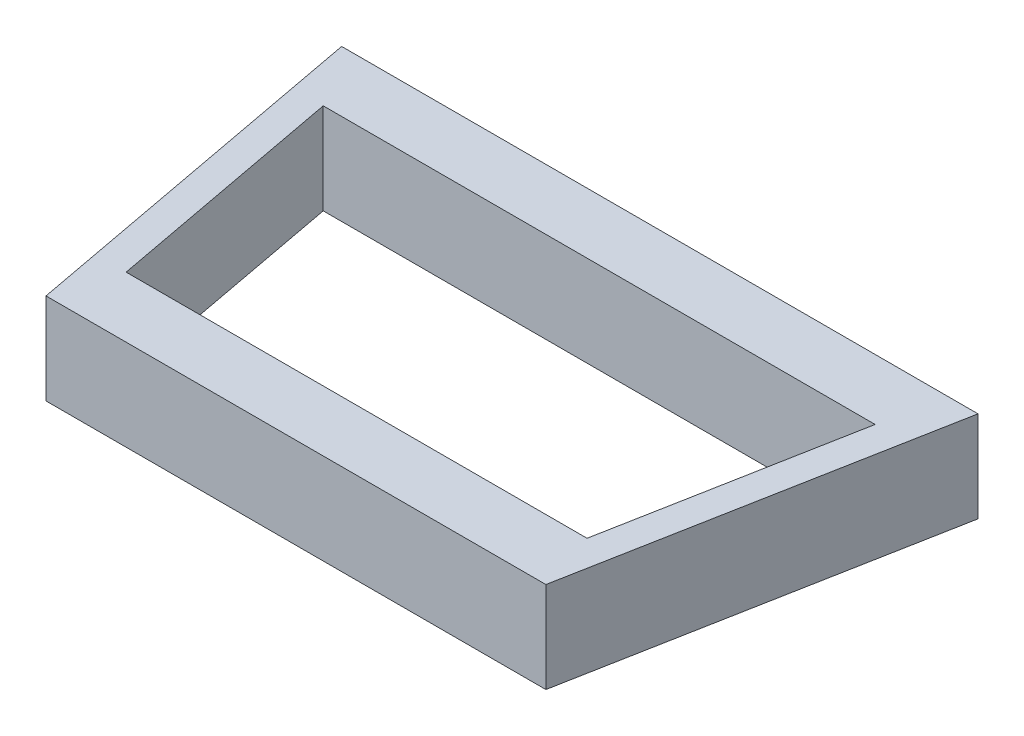
ISO-10303-21;
HEADER;
FILE_DESCRIPTION(('STEP AP214'),'2;1');
FILE_NAME('part.step','',(''),(''),'','','');
FILE_SCHEMA(('AUTOMOTIVE_DESIGN { 1 0 10303 214 1 1 1 1 }'));
ENDSEC;
DATA;
#1=APPLICATION_CONTEXT('core data for automotive mechanical design processes');
#2=APPLICATION_PROTOCOL_DEFINITION('international standard','automotive_design',2000,#1);
#3=PRODUCT_CONTEXT('',#1,'mechanical');
#4=PRODUCT('Part','Part','',(#3));
#5=PRODUCT_RELATED_PRODUCT_CATEGORY('part','',(#4));
#6=PRODUCT_DEFINITION_FORMATION('','',#4);
#7=PRODUCT_DEFINITION_CONTEXT('part definition',#1,'design');
#8=PRODUCT_DEFINITION('design','',#6,#7);
#9=PRODUCT_DEFINITION_SHAPE('','',#8);
#10=(LENGTH_UNIT() NAMED_UNIT(*) SI_UNIT(.MILLI.,.METRE.));
#11=(NAMED_UNIT(*) PLANE_ANGLE_UNIT() SI_UNIT($,.RADIAN.));
#12=(NAMED_UNIT(*) SI_UNIT($,.STERADIAN.) SOLID_ANGLE_UNIT());
#13=UNCERTAINTY_MEASURE_WITH_UNIT(LENGTH_MEASURE(1.E-05),#10,'distance_accuracy_value','');
#14=(GEOMETRIC_REPRESENTATION_CONTEXT(3) GLOBAL_UNCERTAINTY_ASSIGNED_CONTEXT((#13)) GLOBAL_UNIT_ASSIGNED_CONTEXT((#10,
#11,#12)) REPRESENTATION_CONTEXT('',''));
#15=CARTESIAN_POINT('',(0.,0.,0.));
#16=DIRECTION('',(0.,0.,1.));
#17=DIRECTION('',(1.,0.,0.));
#18=AXIS2_PLACEMENT_3D('',#15,#16,#17);
#19=CARTESIAN_POINT('',(0.,3.,0.));
#20=DIRECTION('',(0.,-1.,0.));
#21=DIRECTION('',(0.,0.,-1.));
#22=AXIS2_PLACEMENT_3D('',#19,#20,#21);
#23=PLANE('',#22);
#24=DIRECTION('',(-0.184288535050185,0.,-0.982872186934322));
#25=VECTOR('',#24,1.);
#26=CARTESIAN_POINT('',(-7.6,3.,4.));
#27=LINE('',#26,#25);
#28=CARTESIAN_POINT('',(-7.6,3.,4.));
#29=VERTEX_POINT('',#28);
#30=CARTESIAN_POINT('',(-9.1,3.,-4.));
#31=VERTEX_POINT('',#30);
#32=EDGE_CURVE('E108',#29,#31,#27,.T.);
#33=ORIENTED_EDGE('',*,*,#32,.T.);
#34=DIRECTION('',(1.,0.,0.));
#35=VECTOR('',#34,1.);
#36=CARTESIAN_POINT('',(-9.1,3.,-4.));
#37=LINE('',#36,#35);
#38=CARTESIAN_POINT('',(9.1,3.,-4.));
#39=VERTEX_POINT('',#38);
#40=EDGE_CURVE('E12',#31,#39,#37,.T.);
#41=ORIENTED_EDGE('',*,*,#40,.T.);
#42=DIRECTION('',(-0.184288535050185,0.,0.982872186934322));
#43=VECTOR('',#42,1.);
#44=CARTESIAN_POINT('',(9.1,3.,-4.));
#45=LINE('',#44,#43);
#46=CARTESIAN_POINT('',(7.6,3.,4.));
#47=VERTEX_POINT('',#46);
#48=EDGE_CURVE('E44',#39,#47,#45,.T.);
#49=ORIENTED_EDGE('',*,*,#48,.T.);
#50=DIRECTION('',(-1.,0.,0.));
#51=VECTOR('',#50,1.);
#52=CARTESIAN_POINT('',(7.6,3.,4.));
#53=LINE('',#52,#51);
#54=EDGE_CURVE('E154',#47,#29,#53,.T.);
#55=ORIENTED_EDGE('',*,*,#54,.T.);
#56=EDGE_LOOP('',(#33,#41,#49,#55));
#57=FACE_BOUND('',#56,.T.);
#58=DIRECTION('',(-1.,0.,0.));
#59=VECTOR('',#58,1.);
#60=CARTESIAN_POINT('',(8.24242628725623,3.,6.));
#61=LINE('',#60,#59);
#62=CARTESIAN_POINT('',(8.24242628725623,3.,6.));
#63=VERTEX_POINT('',#62);
#64=CARTESIAN_POINT('',(-8.24242628725623,3.,6.));
#65=VERTEX_POINT('',#64);
#66=EDGE_CURVE('E157',#63,#65,#61,.T.);
#67=ORIENTED_EDGE('',*,*,#66,.F.);
#68=DIRECTION('',(-0.184288535050185,0.,0.982872186934322));
#69=VECTOR('',#68,1.);
#70=CARTESIAN_POINT('',(10.4924262872562,3.,-6.));
#71=LINE('',#70,#69);
#72=CARTESIAN_POINT('',(10.4924262872562,3.,-6.));
#73=VERTEX_POINT('',#72);
#74=EDGE_CURVE('E151',#73,#63,#71,.T.);
#75=ORIENTED_EDGE('',*,*,#74,.F.);
#76=DIRECTION('',(1.,0.,0.));
#77=VECTOR('',#76,1.);
#78=CARTESIAN_POINT('',(-10.4924262872562,3.,-6.));
#79=LINE('',#78,#77);
#80=CARTESIAN_POINT('',(-10.4924262872562,3.,-6.));
#81=VERTEX_POINT('',#80);
#82=EDGE_CURVE('E159',#81,#73,#79,.T.);
#83=ORIENTED_EDGE('',*,*,#82,.F.);
#84=DIRECTION('',(-0.184288535050186,0.,-0.982872186934322));
#85=VECTOR('',#84,1.);
#86=CARTESIAN_POINT('',(-8.24242628725623,3.,6.));
#87=LINE('',#86,#85);
#88=EDGE_CURVE('E39',#65,#81,#87,.T.);
#89=ORIENTED_EDGE('',*,*,#88,.F.);
#90=EDGE_LOOP('',(#67,#75,#83,#89));
#91=FACE_BOUND('',#90,.T.);
#92=ADVANCED_FACE('F36',(#57,#91),#23,.F.);
#93=CARTESIAN_POINT('',(7.6,10.,4.));
#94=DIRECTION('',(0.,0.,-1.));
#95=DIRECTION('',(-1.,0.,0.));
#96=AXIS2_PLACEMENT_3D('',#93,#94,#95);
#97=PLANE('',#96);
#98=ORIENTED_EDGE('',*,*,#54,.F.);
#99=DIRECTION('',(0.,-1.,0.));
#100=VECTOR('',#99,1.);
#101=CARTESIAN_POINT('',(7.6,10.,4.));
#102=LINE('',#101,#100);
#103=CARTESIAN_POINT('',(7.6,0.,4.));
#104=VERTEX_POINT('',#103);
#105=EDGE_CURVE('E111',#47,#104,#102,.T.);
#106=ORIENTED_EDGE('',*,*,#105,.T.);
#107=DIRECTION('',(1.,0.,0.));
#108=VECTOR('',#107,1.);
#109=CARTESIAN_POINT('',(7.6,0.,4.));
#110=LINE('',#109,#108);
#111=CARTESIAN_POINT('',(-7.6,0.,4.));
#112=VERTEX_POINT('',#111);
#113=EDGE_CURVE('E114',#112,#104,#110,.T.);
#114=ORIENTED_EDGE('',*,*,#113,.F.);
#115=DIRECTION('',(0.,-1.,0.));
#116=VECTOR('',#115,1.);
#117=CARTESIAN_POINT('',(-7.6,10.,4.));
#118=LINE('',#117,#116);
#119=EDGE_CURVE('E101',#29,#112,#118,.T.);
#120=ORIENTED_EDGE('',*,*,#119,.F.);
#121=EDGE_LOOP('',(#98,#106,#114,#120));
#122=FACE_BOUND('',#121,.T.);
#123=ADVANCED_FACE('F115',(#122),#97,.T.);
#124=CARTESIAN_POINT('',(9.1,10.,-4.));
#125=DIRECTION('',(-0.982872186934322,0.,-0.184288535050185));
#126=DIRECTION('',(-0.184288535050185,0.,0.982872186934322));
#127=AXIS2_PLACEMENT_3D('',#124,#125,#126);
#128=PLANE('',#127);
#129=ORIENTED_EDGE('',*,*,#48,.F.);
#130=DIRECTION('',(0.,-1.,0.));
#131=VECTOR('',#130,1.);
#132=CARTESIAN_POINT('',(9.1,10.,-4.));
#133=LINE('',#132,#131);
#134=CARTESIAN_POINT('',(9.1,0.,-4.));
#135=VERTEX_POINT('',#134);
#136=EDGE_CURVE('E130',#39,#135,#133,.T.);
#137=ORIENTED_EDGE('',*,*,#136,.T.);
#138=DIRECTION('',(0.184288535050185,0.,-0.982872186934322));
#139=VECTOR('',#138,1.);
#140=CARTESIAN_POINT('',(9.1,0.,-4.));
#141=LINE('',#140,#139);
#142=EDGE_CURVE('E119',#104,#135,#141,.T.);
#143=ORIENTED_EDGE('',*,*,#142,.F.);
#144=ORIENTED_EDGE('',*,*,#105,.F.);
#145=EDGE_LOOP('',(#129,#137,#143,#144));
#146=FACE_BOUND('',#145,.T.);
#147=ADVANCED_FACE('F197',(#146),#128,.T.);
#148=CARTESIAN_POINT('',(0.,0.,0.));
#149=DIRECTION('',(0.,-1.,0.));
#150=DIRECTION('',(0.,0.,-1.));
#151=AXIS2_PLACEMENT_3D('',#148,#149,#150);
#152=PLANE('',#151);
#153=DIRECTION('',(0.184288535050185,0.,0.982872186934322));
#154=VECTOR('',#153,1.);
#155=CARTESIAN_POINT('',(-8.24242628725623,0.,6.));
#156=LINE('',#155,#154);
#157=CARTESIAN_POINT('',(-10.4924262872562,0.,-6.));
#158=VERTEX_POINT('',#157);
#159=CARTESIAN_POINT('',(-8.24242628725623,0.,6.));
#160=VERTEX_POINT('',#159);
#161=EDGE_CURVE('E110',#158,#160,#156,.T.);
#162=ORIENTED_EDGE('',*,*,#161,.F.);
#163=DIRECTION('',(-1.,0.,0.));
#164=VECTOR('',#163,1.);
#165=CARTESIAN_POINT('',(-10.4924262872562,0.,-6.));
#166=LINE('',#165,#164);
#167=CARTESIAN_POINT('',(10.4924262872562,0.,-6.));
#168=VERTEX_POINT('',#167);
#169=EDGE_CURVE('E141',#168,#158,#166,.T.);
#170=ORIENTED_EDGE('',*,*,#169,.F.);
#171=DIRECTION('',(0.184288535050185,0.,-0.982872186934322));
#172=VECTOR('',#171,1.);
#173=CARTESIAN_POINT('',(10.4924262872562,0.,-6.));
#174=LINE('',#173,#172);
#175=CARTESIAN_POINT('',(8.24242628725623,0.,6.));
#176=VERTEX_POINT('',#175);
#177=EDGE_CURVE('E138',#176,#168,#174,.T.);
#178=ORIENTED_EDGE('',*,*,#177,.F.);
#179=DIRECTION('',(1.,0.,0.));
#180=VECTOR('',#179,1.);
#181=CARTESIAN_POINT('',(8.24242628725623,0.,6.));
#182=LINE('',#181,#180);
#183=EDGE_CURVE('E135',#160,#176,#182,.T.);
#184=ORIENTED_EDGE('',*,*,#183,.F.);
#185=EDGE_LOOP('',(#162,#170,#178,#184));
#186=FACE_BOUND('',#185,.T.);
#187=DIRECTION('',(-1.,0.,0.));
#188=VECTOR('',#187,1.);
#189=CARTESIAN_POINT('',(-9.1,0.,-4.));
#190=LINE('',#189,#188);
#191=CARTESIAN_POINT('',(-9.1,0.,-4.));
#192=VERTEX_POINT('',#191);
#193=EDGE_CURVE('E123',#135,#192,#190,.T.);
#194=ORIENTED_EDGE('',*,*,#193,.T.);
#195=DIRECTION('',(0.184288535050185,0.,0.982872186934322));
#196=VECTOR('',#195,1.);
#197=CARTESIAN_POINT('',(-7.6,0.,4.));
#198=LINE('',#197,#196);
#199=EDGE_CURVE('E106',#192,#112,#198,.T.);
#200=ORIENTED_EDGE('',*,*,#199,.T.);
#201=ORIENTED_EDGE('',*,*,#113,.T.);
#202=ORIENTED_EDGE('',*,*,#142,.T.);
#203=EDGE_LOOP('',(#194,#200,#201,#202));
#204=FACE_BOUND('',#203,.T.);
#205=ADVANCED_FACE('F121',(#186,#204),#152,.T.);
#206=CARTESIAN_POINT('',(-7.6,10.,4.));
#207=DIRECTION('',(0.982872186934322,0.,-0.184288535050185));
#208=DIRECTION('',(-0.184288535050185,0.,-0.982872186934322));
#209=AXIS2_PLACEMENT_3D('',#206,#207,#208);
#210=PLANE('',#209);
#211=ORIENTED_EDGE('',*,*,#32,.F.);
#212=ORIENTED_EDGE('',*,*,#119,.T.);
#213=ORIENTED_EDGE('',*,*,#199,.F.);
#214=DIRECTION('',(0.,-1.,0.));
#215=VECTOR('',#214,1.);
#216=CARTESIAN_POINT('',(-9.1,10.,-4.));
#217=LINE('',#216,#215);
#218=EDGE_CURVE('E128',#31,#192,#217,.T.);
#219=ORIENTED_EDGE('',*,*,#218,.F.);
#220=EDGE_LOOP('',(#211,#212,#213,#219));
#221=FACE_BOUND('',#220,.T.);
#222=ADVANCED_FACE('F103',(#221),#210,.T.);
#223=CARTESIAN_POINT('',(-9.1,10.,-4.));
#224=DIRECTION('',(0.,0.,1.));
#225=DIRECTION('',(1.,0.,0.));
#226=AXIS2_PLACEMENT_3D('',#223,#224,#225);
#227=PLANE('',#226);
#228=ORIENTED_EDGE('',*,*,#40,.F.);
#229=ORIENTED_EDGE('',*,*,#218,.T.);
#230=ORIENTED_EDGE('',*,*,#193,.F.);
#231=ORIENTED_EDGE('',*,*,#136,.F.);
#232=EDGE_LOOP('',(#228,#229,#230,#231));
#233=FACE_BOUND('',#232,.T.);
#234=ADVANCED_FACE('F189',(#233),#227,.T.);
#235=CARTESIAN_POINT('',(8.24242628725623,10.,6.));
#236=DIRECTION('',(0.,0.,-1.));
#237=DIRECTION('',(-1.,0.,0.));
#238=AXIS2_PLACEMENT_3D('',#235,#236,#237);
#239=PLANE('',#238);
#240=DIRECTION('',(0.,-1.,0.));
#241=VECTOR('',#240,1.);
#242=CARTESIAN_POINT('',(8.24242628725623,10.,6.));
#243=LINE('',#242,#241);
#244=EDGE_CURVE('E148',#63,#176,#243,.T.);
#245=ORIENTED_EDGE('',*,*,#244,.F.);
#246=ORIENTED_EDGE('',*,*,#66,.T.);
#247=DIRECTION('',(0.,-1.,0.));
#248=VECTOR('',#247,1.);
#249=CARTESIAN_POINT('',(-8.24242628725623,10.,6.));
#250=LINE('',#249,#248);
#251=EDGE_CURVE('E150',#65,#160,#250,.T.);
#252=ORIENTED_EDGE('',*,*,#251,.T.);
#253=ORIENTED_EDGE('',*,*,#183,.T.);
#254=EDGE_LOOP('',(#245,#246,#252,#253));
#255=FACE_BOUND('',#254,.T.);
#256=ADVANCED_FACE('F165',(#255),#239,.F.);
#257=CARTESIAN_POINT('',(-10.4924262872562,10.,-6.));
#258=DIRECTION('',(0.,0.,1.));
#259=DIRECTION('',(1.,0.,0.));
#260=AXIS2_PLACEMENT_3D('',#257,#258,#259);
#261=PLANE('',#260);
#262=DIRECTION('',(0.,-1.,0.));
#263=VECTOR('',#262,1.);
#264=CARTESIAN_POINT('',(-10.4924262872562,10.,-6.));
#265=LINE('',#264,#263);
#266=EDGE_CURVE('E144',#81,#158,#265,.T.);
#267=ORIENTED_EDGE('',*,*,#266,.F.);
#268=ORIENTED_EDGE('',*,*,#82,.T.);
#269=DIRECTION('',(0.,-1.,0.));
#270=VECTOR('',#269,1.);
#271=CARTESIAN_POINT('',(10.4924262872562,10.,-6.));
#272=LINE('',#271,#270);
#273=EDGE_CURVE('E146',#73,#168,#272,.T.);
#274=ORIENTED_EDGE('',*,*,#273,.T.);
#275=ORIENTED_EDGE('',*,*,#169,.T.);
#276=EDGE_LOOP('',(#267,#268,#274,#275));
#277=FACE_BOUND('',#276,.T.);
#278=ADVANCED_FACE('F181',(#277),#261,.F.);
#279=CARTESIAN_POINT('',(10.4924262872562,10.,-6.));
#280=DIRECTION('',(-0.982872186934322,0.,-0.184288535050185));
#281=DIRECTION('',(-0.184288535050185,0.,0.982872186934322));
#282=AXIS2_PLACEMENT_3D('',#279,#280,#281);
#283=PLANE('',#282);
#284=ORIENTED_EDGE('',*,*,#273,.F.);
#285=ORIENTED_EDGE('',*,*,#74,.T.);
#286=ORIENTED_EDGE('',*,*,#244,.T.);
#287=ORIENTED_EDGE('',*,*,#177,.T.);
#288=EDGE_LOOP('',(#284,#285,#286,#287));
#289=FACE_BOUND('',#288,.T.);
#290=ADVANCED_FACE('F179',(#289),#283,.F.);
#291=CARTESIAN_POINT('',(-8.24242628725623,10.,6.));
#292=DIRECTION('',(0.982872186934322,0.,-0.184288535050186));
#293=DIRECTION('',(-0.184288535050186,0.,-0.982872186934322));
#294=AXIS2_PLACEMENT_3D('',#291,#292,#293);
#295=PLANE('',#294);
#296=ORIENTED_EDGE('',*,*,#251,.F.);
#297=ORIENTED_EDGE('',*,*,#88,.T.);
#298=ORIENTED_EDGE('',*,*,#266,.T.);
#299=ORIENTED_EDGE('',*,*,#161,.T.);
#300=EDGE_LOOP('',(#296,#297,#298,#299));
#301=FACE_BOUND('',#300,.T.);
#302=ADVANCED_FACE('F170',(#301),#295,.F.);
#303=CLOSED_SHELL('',(#92,#123,#147,#205,#222,#234,#256,#278,#290,#302));
#304=MANIFOLD_SOLID_BREP('B2',#303);
#305=ADVANCED_BREP_SHAPE_REPRESENTATION('',(#18,#304),#14);
#306=SHAPE_DEFINITION_REPRESENTATION(#9,#305);
ENDSEC;
END-ISO-10303-21;
